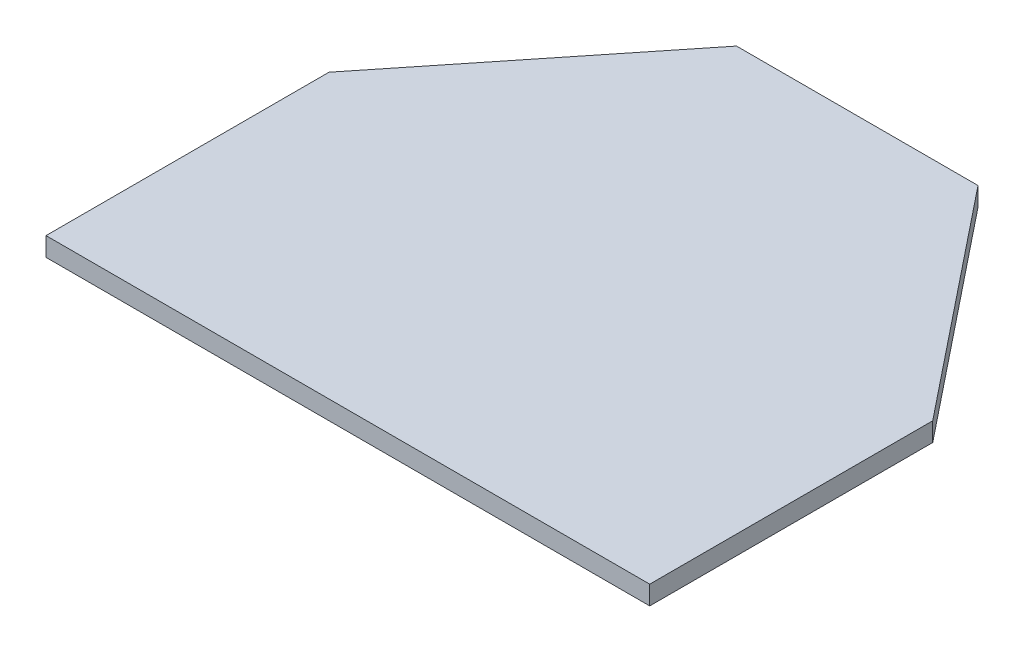
ISO-10303-21;
HEADER;
FILE_DESCRIPTION(('STEP AP214'),'2;1');
FILE_NAME('part.step','',(''),(''),'','','');
FILE_SCHEMA(('AUTOMOTIVE_DESIGN { 1 0 10303 214 1 1 1 1 }'));
ENDSEC;
DATA;
#1=APPLICATION_CONTEXT('core data for automotive mechanical design processes');
#2=APPLICATION_PROTOCOL_DEFINITION('international standard','automotive_design',2000,#1);
#3=PRODUCT_CONTEXT('',#1,'mechanical');
#4=PRODUCT('Part','Part','',(#3));
#5=PRODUCT_RELATED_PRODUCT_CATEGORY('part','',(#4));
#6=PRODUCT_DEFINITION_FORMATION('','',#4);
#7=PRODUCT_DEFINITION_CONTEXT('part definition',#1,'design');
#8=PRODUCT_DEFINITION('design','',#6,#7);
#9=PRODUCT_DEFINITION_SHAPE('','',#8);
#10=(LENGTH_UNIT() NAMED_UNIT(*) SI_UNIT(.MILLI.,.METRE.));
#11=(NAMED_UNIT(*) PLANE_ANGLE_UNIT() SI_UNIT($,.RADIAN.));
#12=(NAMED_UNIT(*) SI_UNIT($,.STERADIAN.) SOLID_ANGLE_UNIT());
#13=UNCERTAINTY_MEASURE_WITH_UNIT(LENGTH_MEASURE(1.E-05),#10,'distance_accuracy_value','');
#14=(GEOMETRIC_REPRESENTATION_CONTEXT(3) GLOBAL_UNCERTAINTY_ASSIGNED_CONTEXT((#13)) GLOBAL_UNIT_ASSIGNED_CONTEXT((#10,
#11,#12)) REPRESENTATION_CONTEXT('',''));
#15=CARTESIAN_POINT('',(0.,0.,0.));
#16=DIRECTION('',(0.,0.,1.));
#17=DIRECTION('',(1.,0.,0.));
#18=AXIS2_PLACEMENT_3D('',#15,#16,#17);
#19=CARTESIAN_POINT('',(-80.,2.5,-75.));
#20=DIRECTION('',(1.,0.,0.));
#21=DIRECTION('',(0.,0.,-1.));
#22=AXIS2_PLACEMENT_3D('',#19,#20,#21);
#23=PLANE('',#22);
#24=DIRECTION('',(0.,0.,1.));
#25=VECTOR('',#24,1.);
#26=CARTESIAN_POINT('',(-80.,-2.5,-75.));
#27=LINE('',#26,#25);
#28=CARTESIAN_POINT('',(-80.,-2.5,-75.));
#29=VERTEX_POINT('',#28);
#30=CARTESIAN_POINT('',(-80.,-2.5,0.));
#31=VERTEX_POINT('',#30);
#32=EDGE_CURVE('E114',#29,#31,#27,.T.);
#33=ORIENTED_EDGE('',*,*,#32,.T.);
#34=DIRECTION('',(0.,-1.,0.));
#35=VECTOR('',#34,1.);
#36=CARTESIAN_POINT('',(-80.,2.5,0.));
#37=LINE('',#36,#35);
#38=CARTESIAN_POINT('',(-80.,2.5,0.));
#39=VERTEX_POINT('',#38);
#40=EDGE_CURVE('E43',#39,#31,#37,.T.);
#41=ORIENTED_EDGE('',*,*,#40,.F.);
#42=DIRECTION('',(0.,0.,1.));
#43=VECTOR('',#42,1.);
#44=CARTESIAN_POINT('',(-80.,2.5,-75.));
#45=LINE('',#44,#43);
#46=CARTESIAN_POINT('',(-80.,2.5,-75.));
#47=VERTEX_POINT('',#46);
#48=EDGE_CURVE('E124',#47,#39,#45,.T.);
#49=ORIENTED_EDGE('',*,*,#48,.F.);
#50=DIRECTION('',(0.,-1.,0.));
#51=VECTOR('',#50,1.);
#52=CARTESIAN_POINT('',(-80.,2.5,-75.));
#53=LINE('',#52,#51);
#54=EDGE_CURVE('E105',#47,#29,#53,.T.);
#55=ORIENTED_EDGE('',*,*,#54,.T.);
#56=EDGE_LOOP('',(#33,#41,#49,#55));
#57=FACE_BOUND('',#56,.T.);
#58=ADVANCED_FACE('F36',(#57),#23,.F.);
#59=CARTESIAN_POINT('',(-80.,2.5,0.));
#60=DIRECTION('',(0.,0.,-1.));
#61=DIRECTION('',(-1.,0.,0.));
#62=AXIS2_PLACEMENT_3D('',#59,#60,#61);
#63=PLANE('',#62);
#64=DIRECTION('',(1.,0.,0.));
#65=VECTOR('',#64,1.);
#66=CARTESIAN_POINT('',(-80.,-2.5,0.));
#67=LINE('',#66,#65);
#68=CARTESIAN_POINT('',(80.,-2.5,0.));
#69=VERTEX_POINT('',#68);
#70=EDGE_CURVE('E117',#31,#69,#67,.T.);
#71=ORIENTED_EDGE('',*,*,#70,.T.);
#72=DIRECTION('',(0.,-1.,0.));
#73=VECTOR('',#72,1.);
#74=CARTESIAN_POINT('',(80.,2.5,0.));
#75=LINE('',#74,#73);
#76=CARTESIAN_POINT('',(80.,2.5,0.));
#77=VERTEX_POINT('',#76);
#78=EDGE_CURVE('E128',#77,#69,#75,.T.);
#79=ORIENTED_EDGE('',*,*,#78,.F.);
#80=DIRECTION('',(1.,0.,0.));
#81=VECTOR('',#80,1.);
#82=CARTESIAN_POINT('',(-80.,2.5,0.));
#83=LINE('',#82,#81);
#84=EDGE_CURVE('E88',#39,#77,#83,.T.);
#85=ORIENTED_EDGE('',*,*,#84,.F.);
#86=ORIENTED_EDGE('',*,*,#40,.T.);
#87=EDGE_LOOP('',(#71,#79,#85,#86));
#88=FACE_BOUND('',#87,.T.);
#89=ADVANCED_FACE('F131',(#88),#63,.F.);
#90=CARTESIAN_POINT('',(80.,2.5,0.));
#91=DIRECTION('',(-1.,0.,0.));
#92=DIRECTION('',(0.,0.,1.));
#93=AXIS2_PLACEMENT_3D('',#90,#91,#92);
#94=PLANE('',#93);
#95=DIRECTION('',(0.,0.,-1.));
#96=VECTOR('',#95,1.);
#97=CARTESIAN_POINT('',(80.,-2.5,0.));
#98=LINE('',#97,#96);
#99=CARTESIAN_POINT('',(80.,-2.5,-75.));
#100=VERTEX_POINT('',#99);
#101=EDGE_CURVE('E119',#69,#100,#98,.T.);
#102=ORIENTED_EDGE('',*,*,#101,.T.);
#103=DIRECTION('',(0.,-1.,0.));
#104=VECTOR('',#103,1.);
#105=CARTESIAN_POINT('',(80.,2.5,-75.));
#106=LINE('',#105,#104);
#107=CARTESIAN_POINT('',(80.,2.5,-75.));
#108=VERTEX_POINT('',#107);
#109=EDGE_CURVE('E108',#108,#100,#106,.T.);
#110=ORIENTED_EDGE('',*,*,#109,.F.);
#111=DIRECTION('',(0.,0.,-1.));
#112=VECTOR('',#111,1.);
#113=CARTESIAN_POINT('',(80.,2.5,0.));
#114=LINE('',#113,#112);
#115=EDGE_CURVE('E110',#77,#108,#114,.T.);
#116=ORIENTED_EDGE('',*,*,#115,.F.);
#117=ORIENTED_EDGE('',*,*,#78,.T.);
#118=EDGE_LOOP('',(#102,#110,#116,#117));
#119=FACE_BOUND('',#118,.T.);
#120=ADVANCED_FACE('F140',(#119),#94,.F.);
#121=CARTESIAN_POINT('',(80.,2.5,-75.));
#122=DIRECTION('',(-0.78086880944303,0.,0.624695047554424));
#123=DIRECTION('',(0.624695047554424,0.,0.78086880944303));
#124=AXIS2_PLACEMENT_3D('',#121,#122,#123);
#125=PLANE('',#124);
#126=DIRECTION('',(-0.624695047554424,0.,-0.78086880944303));
#127=VECTOR('',#126,1.);
#128=CARTESIAN_POINT('',(80.,-2.5,-75.));
#129=LINE('',#128,#127);
#130=CARTESIAN_POINT('',(32.,-2.5,-135.));
#131=VERTEX_POINT('',#130);
#132=EDGE_CURVE('E121',#100,#131,#129,.T.);
#133=ORIENTED_EDGE('',*,*,#132,.T.);
#134=DIRECTION('',(0.,1.,0.));
#135=VECTOR('',#134,1.);
#136=CARTESIAN_POINT('',(32.,2.5,-135.));
#137=LINE('',#136,#135);
#138=CARTESIAN_POINT('',(32.,2.5,-135.));
#139=VERTEX_POINT('',#138);
#140=EDGE_CURVE('E50',#131,#139,#137,.T.);
#141=ORIENTED_EDGE('',*,*,#140,.T.);
#142=DIRECTION('',(-0.624695047554424,0.,-0.78086880944303));
#143=VECTOR('',#142,1.);
#144=CARTESIAN_POINT('',(80.,2.5,-75.));
#145=LINE('',#144,#143);
#146=EDGE_CURVE('E102',#108,#139,#145,.T.);
#147=ORIENTED_EDGE('',*,*,#146,.F.);
#148=ORIENTED_EDGE('',*,*,#109,.T.);
#149=EDGE_LOOP('',(#133,#141,#147,#148));
#150=FACE_BOUND('',#149,.T.);
#151=ADVANCED_FACE('F143',(#150),#125,.F.);
#152=CARTESIAN_POINT('',(0.,2.5,-175.));
#153=DIRECTION('',(0.78086880944303,0.,0.624695047554424));
#154=DIRECTION('',(0.624695047554424,0.,-0.78086880944303));
#155=AXIS2_PLACEMENT_3D('',#152,#153,#154);
#156=PLANE('',#155);
#157=DIRECTION('',(-0.624695047554424,0.,0.78086880944303));
#158=VECTOR('',#157,1.);
#159=CARTESIAN_POINT('',(0.,2.5,-175.));
#160=LINE('',#159,#158);
#161=CARTESIAN_POINT('',(-32.,2.5,-135.));
#162=VERTEX_POINT('',#161);
#163=EDGE_CURVE('E58',#162,#47,#160,.T.);
#164=ORIENTED_EDGE('',*,*,#163,.F.);
#165=DIRECTION('',(0.,-1.,0.));
#166=VECTOR('',#165,1.);
#167=CARTESIAN_POINT('',(-32.,2.5,-135.));
#168=LINE('',#167,#166);
#169=CARTESIAN_POINT('',(-32.,-2.5,-135.));
#170=VERTEX_POINT('',#169);
#171=EDGE_CURVE('E95',#162,#170,#168,.T.);
#172=ORIENTED_EDGE('',*,*,#171,.T.);
#173=DIRECTION('',(-0.624695047554424,0.,0.78086880944303));
#174=VECTOR('',#173,1.);
#175=CARTESIAN_POINT('',(0.,-2.5,-175.));
#176=LINE('',#175,#174);
#177=EDGE_CURVE('E80',#170,#29,#176,.T.);
#178=ORIENTED_EDGE('',*,*,#177,.T.);
#179=ORIENTED_EDGE('',*,*,#54,.F.);
#180=EDGE_LOOP('',(#164,#172,#178,#179));
#181=FACE_BOUND('',#180,.T.);
#182=ADVANCED_FACE('F104',(#181),#156,.F.);
#183=CARTESIAN_POINT('',(0.,2.5,0.));
#184=DIRECTION('',(0.,1.,0.));
#185=DIRECTION('',(0.,0.,1.));
#186=AXIS2_PLACEMENT_3D('',#183,#184,#185);
#187=PLANE('',#186);
#188=DIRECTION('',(1.,0.,0.));
#189=VECTOR('',#188,1.);
#190=CARTESIAN_POINT('',(-175.,2.5,-135.));
#191=LINE('',#190,#189);
#192=EDGE_CURVE('E97',#162,#139,#191,.T.);
#193=ORIENTED_EDGE('',*,*,#192,.F.);
#194=ORIENTED_EDGE('',*,*,#163,.T.);
#195=ORIENTED_EDGE('',*,*,#48,.T.);
#196=ORIENTED_EDGE('',*,*,#84,.T.);
#197=ORIENTED_EDGE('',*,*,#115,.T.);
#198=ORIENTED_EDGE('',*,*,#146,.T.);
#199=EDGE_LOOP('',(#193,#194,#195,#196,#197,#198));
#200=FACE_BOUND('',#199,.T.);
#201=ADVANCED_FACE('F100',(#200),#187,.T.);
#202=CARTESIAN_POINT('',(0.,-2.5,0.));
#203=DIRECTION('',(0.,1.,0.));
#204=DIRECTION('',(0.,0.,1.));
#205=AXIS2_PLACEMENT_3D('',#202,#203,#204);
#206=PLANE('',#205);
#207=ORIENTED_EDGE('',*,*,#177,.F.);
#208=DIRECTION('',(1.,0.,0.));
#209=VECTOR('',#208,1.);
#210=CARTESIAN_POINT('',(0.,-2.5,-135.));
#211=LINE('',#210,#209);
#212=EDGE_CURVE('E11',#170,#131,#211,.T.);
#213=ORIENTED_EDGE('',*,*,#212,.T.);
#214=ORIENTED_EDGE('',*,*,#132,.F.);
#215=ORIENTED_EDGE('',*,*,#101,.F.);
#216=ORIENTED_EDGE('',*,*,#70,.F.);
#217=ORIENTED_EDGE('',*,*,#32,.F.);
#218=EDGE_LOOP('',(#207,#213,#214,#215,#216,#217));
#219=FACE_BOUND('',#218,.T.);
#220=ADVANCED_FACE('F135',(#219),#206,.F.);
#221=CARTESIAN_POINT('',(-175.,-2.5,-135.));
#222=DIRECTION('',(0.,0.,1.));
#223=DIRECTION('',(1.,0.,0.));
#224=AXIS2_PLACEMENT_3D('',#221,#222,#223);
#225=PLANE('',#224);
#226=ORIENTED_EDGE('',*,*,#212,.F.);
#227=ORIENTED_EDGE('',*,*,#171,.F.);
#228=ORIENTED_EDGE('',*,*,#192,.T.);
#229=ORIENTED_EDGE('',*,*,#140,.F.);
#230=EDGE_LOOP('',(#226,#227,#228,#229));
#231=FACE_BOUND('',#230,.T.);
#232=ADVANCED_FACE('F96',(#231),#225,.F.);
#233=CLOSED_SHELL('',(#58,#89,#120,#151,#182,#201,#220,#232));
#234=MANIFOLD_SOLID_BREP('B2',#233);
#235=ADVANCED_BREP_SHAPE_REPRESENTATION('',(#18,#234),#14);
#236=SHAPE_DEFINITION_REPRESENTATION(#9,#235);
ENDSEC;
END-ISO-10303-21;
